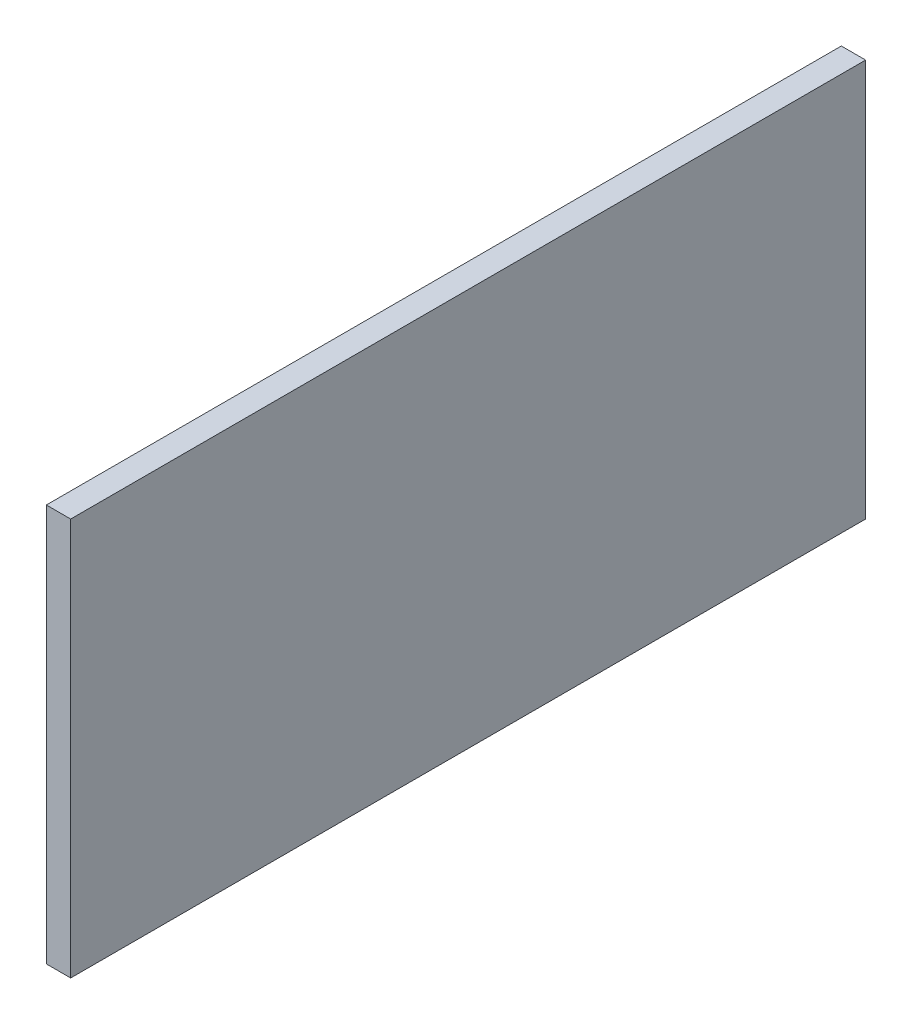
ISO-10303-21;
HEADER;
FILE_DESCRIPTION(('STEP AP214'),'2;1');
FILE_NAME('part.step','',(''),(''),'','','');
FILE_SCHEMA(('AUTOMOTIVE_DESIGN { 1 0 10303 214 1 1 1 1 }'));
ENDSEC;
DATA;
#1=APPLICATION_CONTEXT('core data for automotive mechanical design processes');
#2=APPLICATION_PROTOCOL_DEFINITION('international standard','automotive_design',2000,#1);
#3=PRODUCT_CONTEXT('',#1,'mechanical');
#4=PRODUCT('Part','Part','',(#3));
#5=PRODUCT_RELATED_PRODUCT_CATEGORY('part','',(#4));
#6=PRODUCT_DEFINITION_FORMATION('','',#4);
#7=PRODUCT_DEFINITION_CONTEXT('part definition',#1,'design');
#8=PRODUCT_DEFINITION('design','',#6,#7);
#9=PRODUCT_DEFINITION_SHAPE('','',#8);
#10=(LENGTH_UNIT() NAMED_UNIT(*) SI_UNIT(.MILLI.,.METRE.));
#11=(NAMED_UNIT(*) PLANE_ANGLE_UNIT() SI_UNIT($,.RADIAN.));
#12=(NAMED_UNIT(*) SI_UNIT($,.STERADIAN.) SOLID_ANGLE_UNIT());
#13=UNCERTAINTY_MEASURE_WITH_UNIT(LENGTH_MEASURE(1.E-05),#10,'distance_accuracy_value','');
#14=(GEOMETRIC_REPRESENTATION_CONTEXT(3) GLOBAL_UNCERTAINTY_ASSIGNED_CONTEXT((#13)) GLOBAL_UNIT_ASSIGNED_CONTEXT((#10,
#11,#12)) REPRESENTATION_CONTEXT('',''));
#15=CARTESIAN_POINT('',(0.,0.,0.));
#16=DIRECTION('',(0.,0.,1.));
#17=DIRECTION('',(1.,0.,0.));
#18=AXIS2_PLACEMENT_3D('',#15,#16,#17);
#19=CARTESIAN_POINT('',(12.2428,0.,200.));
#20=DIRECTION('',(0.,0.,-1.));
#21=DIRECTION('',(0.,1.,0.));
#22=AXIS2_PLACEMENT_3D('',#19,#20,#21);
#23=PLANE('',#22);
#24=DIRECTION('',(0.,-1.,0.));
#25=VECTOR('',#24,1.);
#26=CARTESIAN_POINT('',(0.,0.,200.));
#27=LINE('',#26,#25);
#28=CARTESIAN_POINT('',(0.,0.,200.));
#29=VERTEX_POINT('',#28);
#30=CARTESIAN_POINT('',(0.,-200.,200.));
#31=VERTEX_POINT('',#30);
#32=EDGE_CURVE('E96',#29,#31,#27,.T.);
#33=ORIENTED_EDGE('',*,*,#32,.T.);
#34=DIRECTION('',(-1.,0.,0.));
#35=VECTOR('',#34,1.);
#36=CARTESIAN_POINT('',(12.2428,-200.,200.));
#37=LINE('',#36,#35);
#38=CARTESIAN_POINT('',(12.2428,-200.,200.));
#39=VERTEX_POINT('',#38);
#40=EDGE_CURVE('E11',#39,#31,#37,.T.);
#41=ORIENTED_EDGE('',*,*,#40,.F.);
#42=DIRECTION('',(0.,-1.,0.));
#43=VECTOR('',#42,1.);
#44=CARTESIAN_POINT('',(12.2428,0.,200.));
#45=LINE('',#44,#43);
#46=CARTESIAN_POINT('',(12.2428,0.,200.));
#47=VERTEX_POINT('',#46);
#48=EDGE_CURVE('E84',#47,#39,#45,.T.);
#49=ORIENTED_EDGE('',*,*,#48,.F.);
#50=DIRECTION('',(-1.,0.,0.));
#51=VECTOR('',#50,1.);
#52=CARTESIAN_POINT('',(12.2428,0.,200.));
#53=LINE('',#52,#51);
#54=EDGE_CURVE('E92',#47,#29,#53,.T.);
#55=ORIENTED_EDGE('',*,*,#54,.T.);
#56=EDGE_LOOP('',(#33,#41,#49,#55));
#57=FACE_BOUND('',#56,.T.);
#58=ADVANCED_FACE('F33',(#57),#23,.F.);
#59=CARTESIAN_POINT('',(12.2428,-200.,200.));
#60=DIRECTION('',(0.,1.,0.));
#61=DIRECTION('',(0.,0.,1.));
#62=AXIS2_PLACEMENT_3D('',#59,#60,#61);
#63=PLANE('',#62);
#64=DIRECTION('',(0.,0.,-1.));
#65=VECTOR('',#64,1.);
#66=CARTESIAN_POINT('',(0.,-200.,200.));
#67=LINE('',#66,#65);
#68=CARTESIAN_POINT('',(0.,-200.,-200.));
#69=VERTEX_POINT('',#68);
#70=EDGE_CURVE('E88',#31,#69,#67,.T.);
#71=ORIENTED_EDGE('',*,*,#70,.T.);
#72=DIRECTION('',(-1.,0.,0.));
#73=VECTOR('',#72,1.);
#74=CARTESIAN_POINT('',(12.2428,-200.,-200.));
#75=LINE('',#74,#73);
#76=CARTESIAN_POINT('',(12.2428,-200.,-200.));
#77=VERTEX_POINT('',#76);
#78=EDGE_CURVE('E41',#77,#69,#75,.T.);
#79=ORIENTED_EDGE('',*,*,#78,.F.);
#80=DIRECTION('',(0.,0.,-1.));
#81=VECTOR('',#80,1.);
#82=CARTESIAN_POINT('',(12.2428,-200.,200.));
#83=LINE('',#82,#81);
#84=EDGE_CURVE('E79',#39,#77,#83,.T.);
#85=ORIENTED_EDGE('',*,*,#84,.F.);
#86=ORIENTED_EDGE('',*,*,#40,.T.);
#87=EDGE_LOOP('',(#71,#79,#85,#86));
#88=FACE_BOUND('',#87,.T.);
#89=ADVANCED_FACE('F87',(#88),#63,.F.);
#90=CARTESIAN_POINT('',(12.2428,0.,-200.));
#91=DIRECTION('',(0.,0.,1.));
#92=DIRECTION('',(0.,-1.,0.));
#93=AXIS2_PLACEMENT_3D('',#90,#91,#92);
#94=PLANE('',#93);
#95=DIRECTION('',(0.,1.,0.));
#96=VECTOR('',#95,1.);
#97=CARTESIAN_POINT('',(0.,0.,-200.));
#98=LINE('',#97,#96);
#99=CARTESIAN_POINT('',(0.,0.,-200.));
#100=VERTEX_POINT('',#99);
#101=EDGE_CURVE('E66',#69,#100,#98,.T.);
#102=ORIENTED_EDGE('',*,*,#101,.T.);
#103=DIRECTION('',(-1.,0.,0.));
#104=VECTOR('',#103,1.);
#105=CARTESIAN_POINT('',(12.2428,0.,-200.));
#106=LINE('',#105,#104);
#107=CARTESIAN_POINT('',(12.2428,0.,-200.));
#108=VERTEX_POINT('',#107);
#109=EDGE_CURVE('E89',#108,#100,#106,.T.);
#110=ORIENTED_EDGE('',*,*,#109,.F.);
#111=DIRECTION('',(0.,1.,0.));
#112=VECTOR('',#111,1.);
#113=CARTESIAN_POINT('',(12.2428,0.,-200.));
#114=LINE('',#113,#112);
#115=EDGE_CURVE('E82',#77,#108,#114,.T.);
#116=ORIENTED_EDGE('',*,*,#115,.F.);
#117=ORIENTED_EDGE('',*,*,#78,.T.);
#118=EDGE_LOOP('',(#102,#110,#116,#117));
#119=FACE_BOUND('',#118,.T.);
#120=ADVANCED_FACE('F90',(#119),#94,.F.);
#121=CARTESIAN_POINT('',(12.2428,0.,200.));
#122=DIRECTION('',(0.,-1.,0.));
#123=DIRECTION('',(0.,0.,-1.));
#124=AXIS2_PLACEMENT_3D('',#121,#122,#123);
#125=PLANE('',#124);
#126=DIRECTION('',(0.,0.,1.));
#127=VECTOR('',#126,1.);
#128=CARTESIAN_POINT('',(0.,0.,200.));
#129=LINE('',#128,#127);
#130=EDGE_CURVE('E72',#100,#29,#129,.T.);
#131=ORIENTED_EDGE('',*,*,#130,.T.);
#132=ORIENTED_EDGE('',*,*,#54,.F.);
#133=DIRECTION('',(0.,0.,1.));
#134=VECTOR('',#133,1.);
#135=CARTESIAN_POINT('',(12.2428,0.,200.));
#136=LINE('',#135,#134);
#137=EDGE_CURVE('E49',#108,#47,#136,.T.);
#138=ORIENTED_EDGE('',*,*,#137,.F.);
#139=ORIENTED_EDGE('',*,*,#109,.T.);
#140=EDGE_LOOP('',(#131,#132,#138,#139));
#141=FACE_BOUND('',#140,.T.);
#142=ADVANCED_FACE('F103',(#141),#125,.F.);
#143=CARTESIAN_POINT('',(12.2428,0.,0.));
#144=DIRECTION('',(1.,0.,0.));
#145=DIRECTION('',(0.,0.,-1.));
#146=AXIS2_PLACEMENT_3D('',#143,#144,#145);
#147=PLANE('',#146);
#148=ORIENTED_EDGE('',*,*,#48,.T.);
#149=ORIENTED_EDGE('',*,*,#84,.T.);
#150=ORIENTED_EDGE('',*,*,#115,.T.);
#151=ORIENTED_EDGE('',*,*,#137,.T.);
#152=EDGE_LOOP('',(#148,#149,#150,#151));
#153=FACE_BOUND('',#152,.T.);
#154=ADVANCED_FACE('F80',(#153),#147,.T.);
#155=CARTESIAN_POINT('',(0.,0.,0.));
#156=DIRECTION('',(1.,0.,0.));
#157=DIRECTION('',(0.,0.,-1.));
#158=AXIS2_PLACEMENT_3D('',#155,#156,#157);
#159=PLANE('',#158);
#160=ORIENTED_EDGE('',*,*,#32,.F.);
#161=ORIENTED_EDGE('',*,*,#130,.F.);
#162=ORIENTED_EDGE('',*,*,#101,.F.);
#163=ORIENTED_EDGE('',*,*,#70,.F.);
#164=EDGE_LOOP('',(#160,#161,#162,#163));
#165=FACE_BOUND('',#164,.T.);
#166=ADVANCED_FACE('F106',(#165),#159,.F.);
#167=CLOSED_SHELL('',(#58,#89,#120,#142,#154,#166));
#168=MANIFOLD_SOLID_BREP('B2',#167);
#169=ADVANCED_BREP_SHAPE_REPRESENTATION('',(#18,#168),#14);
#170=SHAPE_DEFINITION_REPRESENTATION(#9,#169);
ENDSEC;
END-ISO-10303-21;
